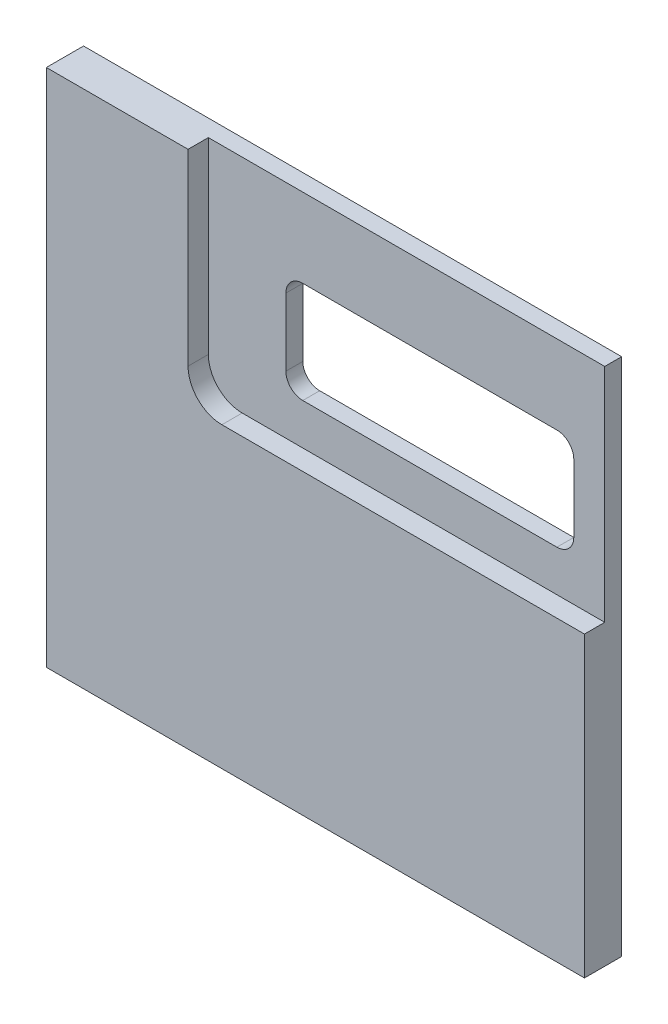
ISO-10303-21;
HEADER;
FILE_DESCRIPTION(('STEP AP214'),'2;1');
FILE_NAME('part.step','',(''),(''),'','','');
FILE_SCHEMA(('AUTOMOTIVE_DESIGN { 1 0 10303 214 1 1 1 1 }'));
ENDSEC;
DATA;
#1=APPLICATION_CONTEXT('core data for automotive mechanical design processes');
#2=APPLICATION_PROTOCOL_DEFINITION('international standard','automotive_design',2000,#1);
#3=PRODUCT_CONTEXT('',#1,'mechanical');
#4=PRODUCT('Part','Part','',(#3));
#5=PRODUCT_RELATED_PRODUCT_CATEGORY('part','',(#4));
#6=PRODUCT_DEFINITION_FORMATION('','',#4);
#7=PRODUCT_DEFINITION_CONTEXT('part definition',#1,'design');
#8=PRODUCT_DEFINITION('design','',#6,#7);
#9=PRODUCT_DEFINITION_SHAPE('','',#8);
#10=(LENGTH_UNIT() NAMED_UNIT(*) SI_UNIT(.MILLI.,.METRE.));
#11=(NAMED_UNIT(*) PLANE_ANGLE_UNIT() SI_UNIT($,.RADIAN.));
#12=(NAMED_UNIT(*) SI_UNIT($,.STERADIAN.) SOLID_ANGLE_UNIT());
#13=UNCERTAINTY_MEASURE_WITH_UNIT(LENGTH_MEASURE(1.E-05),#10,'distance_accuracy_value','');
#14=(GEOMETRIC_REPRESENTATION_CONTEXT(3) GLOBAL_UNCERTAINTY_ASSIGNED_CONTEXT((#13)) GLOBAL_UNIT_ASSIGNED_CONTEXT((#10,
#11,#12)) REPRESENTATION_CONTEXT('',''));
#15=CARTESIAN_POINT('',(0.,0.,0.));
#16=DIRECTION('',(0.,0.,1.));
#17=DIRECTION('',(1.,0.,0.));
#18=AXIS2_PLACEMENT_3D('',#15,#16,#17);
#19=CARTESIAN_POINT('',(14.495,-4.836,-2.53396));
#20=DIRECTION('',(0.,0.,1.));
#21=DIRECTION('',(0.,-1.,0.));
#22=AXIS2_PLACEMENT_3D('',#19,#20,#21);
#23=CYLINDRICAL_SURFACE('',#22,0.5);
#24=CARTESIAN_POINT('',(14.495,-4.836,-0.6));
#25=DIRECTION('',(0.,0.,-1.));
#26=DIRECTION('',(1.,0.,0.));
#27=AXIS2_PLACEMENT_3D('',#24,#25,#26);
#28=CIRCLE('',#27,0.5);
#29=CARTESIAN_POINT('',(14.995,-4.836,-0.6));
#30=VERTEX_POINT('',#29);
#31=CARTESIAN_POINT('',(14.495,-5.336,-0.6));
#32=VERTEX_POINT('',#31);
#33=EDGE_CURVE('E253',#30,#32,#28,.T.);
#34=ORIENTED_EDGE('',*,*,#33,.F.);
#35=DIRECTION('',(0.,0.,1.));
#36=VECTOR('',#35,1.);
#37=CARTESIAN_POINT('',(14.995,-4.836,-1.1));
#38=LINE('',#37,#36);
#39=CARTESIAN_POINT('',(14.995,-4.836,-1.1));
#40=VERTEX_POINT('',#39);
#41=EDGE_CURVE('E47',#40,#30,#38,.T.);
#42=ORIENTED_EDGE('',*,*,#41,.F.);
#43=CARTESIAN_POINT('',(14.495,-4.836,-1.1));
#44=DIRECTION('',(0.,0.,1.));
#45=DIRECTION('',(0.,-1.,0.));
#46=AXIS2_PLACEMENT_3D('',#43,#44,#45);
#47=CIRCLE('',#46,0.5);
#48=CARTESIAN_POINT('',(14.495,-5.336,-1.1));
#49=VERTEX_POINT('',#48);
#50=EDGE_CURVE('E321',#49,#40,#47,.T.);
#51=ORIENTED_EDGE('',*,*,#50,.F.);
#52=DIRECTION('',(0.,0.,1.));
#53=VECTOR('',#52,1.);
#54=CARTESIAN_POINT('',(14.495,-5.336,-1.1));
#55=LINE('',#54,#53);
#56=EDGE_CURVE('E11',#49,#32,#55,.T.);
#57=ORIENTED_EDGE('',*,*,#56,.T.);
#58=EDGE_LOOP('',(#34,#42,#51,#57));
#59=FACE_BOUND('',#58,.T.);
#60=ADVANCED_FACE('F17',(#59),#23,.F.);
#61=CARTESIAN_POINT('',(14.995,-5.336,-1.1));
#62=DIRECTION('',(0.,-1.,0.));
#63=DIRECTION('',(0.,0.,-1.));
#64=AXIS2_PLACEMENT_3D('',#61,#62,#63);
#65=PLANE('',#64);
#66=DIRECTION('',(-1.,0.,0.));
#67=VECTOR('',#66,1.);
#68=CARTESIAN_POINT('',(14.495,-5.336,-1.1));
#69=LINE('',#68,#67);
#70=CARTESIAN_POINT('',(6.982,-5.336,-1.1));
#71=VERTEX_POINT('',#70);
#72=EDGE_CURVE('E314',#49,#71,#69,.T.);
#73=ORIENTED_EDGE('',*,*,#72,.T.);
#74=DIRECTION('',(0.,0.,1.));
#75=VECTOR('',#74,1.);
#76=CARTESIAN_POINT('',(6.982,-5.336,-1.1));
#77=LINE('',#76,#75);
#78=CARTESIAN_POINT('',(6.982,-5.336,-0.6));
#79=VERTEX_POINT('',#78);
#80=EDGE_CURVE('E25',#71,#79,#77,.T.);
#81=ORIENTED_EDGE('',*,*,#80,.T.);
#82=DIRECTION('',(-1.,0.,0.));
#83=VECTOR('',#82,1.);
#84=CARTESIAN_POINT('',(14.495,-5.336,-0.6));
#85=LINE('',#84,#83);
#86=EDGE_CURVE('E267',#32,#79,#85,.T.);
#87=ORIENTED_EDGE('',*,*,#86,.F.);
#88=ORIENTED_EDGE('',*,*,#56,.F.);
#89=EDGE_LOOP('',(#73,#81,#87,#88));
#90=FACE_BOUND('',#89,.T.);
#91=ADVANCED_FACE('F361',(#90),#65,.F.);
#92=CARTESIAN_POINT('',(6.982,-4.836,-2.53396));
#93=DIRECTION('',(0.,0.,1.));
#94=DIRECTION('',(-1.,0.,0.));
#95=AXIS2_PLACEMENT_3D('',#92,#93,#94);
#96=CYLINDRICAL_SURFACE('',#95,0.5);
#97=CARTESIAN_POINT('',(6.982,-4.836,-0.6));
#98=DIRECTION('',(0.,0.,-1.));
#99=DIRECTION('',(0.,-1.,0.));
#100=AXIS2_PLACEMENT_3D('',#97,#98,#99);
#101=CIRCLE('',#100,0.5);
#102=CARTESIAN_POINT('',(6.482,-4.836,-0.6));
#103=VERTEX_POINT('',#102);
#104=EDGE_CURVE('E257',#79,#103,#101,.T.);
#105=ORIENTED_EDGE('',*,*,#104,.F.);
#106=ORIENTED_EDGE('',*,*,#80,.F.);
#107=CARTESIAN_POINT('',(6.982,-4.836,-1.1));
#108=DIRECTION('',(0.,0.,1.));
#109=DIRECTION('',(-1.,0.,0.));
#110=AXIS2_PLACEMENT_3D('',#107,#108,#109);
#111=CIRCLE('',#110,0.5);
#112=CARTESIAN_POINT('',(6.482,-4.836,-1.1));
#113=VERTEX_POINT('',#112);
#114=EDGE_CURVE('E310',#113,#71,#111,.T.);
#115=ORIENTED_EDGE('',*,*,#114,.F.);
#116=DIRECTION('',(0.,0.,1.));
#117=VECTOR('',#116,1.);
#118=CARTESIAN_POINT('',(6.482,-4.836,-1.1));
#119=LINE('',#118,#117);
#120=EDGE_CURVE('E336',#113,#103,#119,.T.);
#121=ORIENTED_EDGE('',*,*,#120,.T.);
#122=EDGE_LOOP('',(#105,#106,#115,#121));
#123=FACE_BOUND('',#122,.T.);
#124=ADVANCED_FACE('F351',(#123),#96,.F.);
#125=CARTESIAN_POINT('',(6.482,-5.336,-1.1));
#126=DIRECTION('',(-1.,0.,0.));
#127=DIRECTION('',(0.,0.,1.));
#128=AXIS2_PLACEMENT_3D('',#125,#126,#127);
#129=PLANE('',#128);
#130=DIRECTION('',(0.,1.,0.));
#131=VECTOR('',#130,1.);
#132=CARTESIAN_POINT('',(6.482,-4.836,-1.1));
#133=LINE('',#132,#131);
#134=CARTESIAN_POINT('',(6.482,-2.836,-1.1));
#135=VERTEX_POINT('',#134);
#136=EDGE_CURVE('E306',#113,#135,#133,.T.);
#137=ORIENTED_EDGE('',*,*,#136,.T.);
#138=DIRECTION('',(0.,0.,1.));
#139=VECTOR('',#138,1.);
#140=CARTESIAN_POINT('',(6.482,-2.836,-1.1));
#141=LINE('',#140,#139);
#142=CARTESIAN_POINT('',(6.482,-2.836,-0.6));
#143=VERTEX_POINT('',#142);
#144=EDGE_CURVE('E294',#135,#143,#141,.T.);
#145=ORIENTED_EDGE('',*,*,#144,.T.);
#146=DIRECTION('',(0.,1.,0.));
#147=VECTOR('',#146,1.);
#148=CARTESIAN_POINT('',(6.482,-4.836,-0.6));
#149=LINE('',#148,#147);
#150=EDGE_CURVE('E245',#103,#143,#149,.T.);
#151=ORIENTED_EDGE('',*,*,#150,.F.);
#152=ORIENTED_EDGE('',*,*,#120,.F.);
#153=EDGE_LOOP('',(#137,#145,#151,#152));
#154=FACE_BOUND('',#153,.T.);
#155=ADVANCED_FACE('F354',(#154),#129,.F.);
#156=CARTESIAN_POINT('',(6.982,-2.836,-2.53396));
#157=DIRECTION('',(0.,0.,1.));
#158=DIRECTION('',(0.,1.,0.));
#159=AXIS2_PLACEMENT_3D('',#156,#157,#158);
#160=CYLINDRICAL_SURFACE('',#159,0.5);
#161=CARTESIAN_POINT('',(6.982,-2.836,-0.6));
#162=DIRECTION('',(0.,0.,-1.));
#163=DIRECTION('',(-1.,0.,0.));
#164=AXIS2_PLACEMENT_3D('',#161,#162,#163);
#165=CIRCLE('',#164,0.5);
#166=CARTESIAN_POINT('',(6.982,-2.336,-0.6));
#167=VERTEX_POINT('',#166);
#168=EDGE_CURVE('E241',#143,#167,#165,.T.);
#169=ORIENTED_EDGE('',*,*,#168,.F.);
#170=ORIENTED_EDGE('',*,*,#144,.F.);
#171=CARTESIAN_POINT('',(6.982,-2.836,-1.1));
#172=DIRECTION('',(0.,0.,1.));
#173=DIRECTION('',(0.,1.,0.));
#174=AXIS2_PLACEMENT_3D('',#171,#172,#173);
#175=CIRCLE('',#174,0.5);
#176=CARTESIAN_POINT('',(6.982,-2.336,-1.1));
#177=VERTEX_POINT('',#176);
#178=EDGE_CURVE('E210',#177,#135,#175,.T.);
#179=ORIENTED_EDGE('',*,*,#178,.F.);
#180=DIRECTION('',(0.,0.,1.));
#181=VECTOR('',#180,1.);
#182=CARTESIAN_POINT('',(6.982,-2.336,-1.1));
#183=LINE('',#182,#181);
#184=EDGE_CURVE('E291',#177,#167,#183,.T.);
#185=ORIENTED_EDGE('',*,*,#184,.T.);
#186=EDGE_LOOP('',(#169,#170,#179,#185));
#187=FACE_BOUND('',#186,.T.);
#188=ADVANCED_FACE('F367',(#187),#160,.F.);
#189=CARTESIAN_POINT('',(6.482,-2.336,-1.1));
#190=DIRECTION('',(0.,1.,0.));
#191=DIRECTION('',(1.,0.,0.));
#192=AXIS2_PLACEMENT_3D('',#189,#190,#191);
#193=PLANE('',#192);
#194=DIRECTION('',(1.,0.,0.));
#195=VECTOR('',#194,1.);
#196=CARTESIAN_POINT('',(6.982,-2.336,-0.6));
#197=LINE('',#196,#195);
#198=CARTESIAN_POINT('',(14.495,-2.336,-0.6));
#199=VERTEX_POINT('',#198);
#200=EDGE_CURVE('E207',#167,#199,#197,.T.);
#201=ORIENTED_EDGE('',*,*,#200,.F.);
#202=ORIENTED_EDGE('',*,*,#184,.F.);
#203=DIRECTION('',(1.,0.,0.));
#204=VECTOR('',#203,1.);
#205=CARTESIAN_POINT('',(6.982,-2.336,-1.1));
#206=LINE('',#205,#204);
#207=CARTESIAN_POINT('',(14.495,-2.336,-1.1));
#208=VERTEX_POINT('',#207);
#209=EDGE_CURVE('E208',#177,#208,#206,.T.);
#210=ORIENTED_EDGE('',*,*,#209,.T.);
#211=DIRECTION('',(0.,0.,1.));
#212=VECTOR('',#211,1.);
#213=CARTESIAN_POINT('',(14.495,-2.336,-1.1));
#214=LINE('',#213,#212);
#215=EDGE_CURVE('E295',#208,#199,#214,.T.);
#216=ORIENTED_EDGE('',*,*,#215,.T.);
#217=EDGE_LOOP('',(#201,#202,#210,#216));
#218=FACE_BOUND('',#217,.T.);
#219=ADVANCED_FACE('F724',(#218),#193,.F.);
#220=CARTESIAN_POINT('',(14.495,-2.836,-2.53396));
#221=DIRECTION('',(0.,0.,1.));
#222=DIRECTION('',(1.,0.,0.));
#223=AXIS2_PLACEMENT_3D('',#220,#221,#222);
#224=CYLINDRICAL_SURFACE('',#223,0.5);
#225=CARTESIAN_POINT('',(14.495,-2.836,-0.6));
#226=DIRECTION('',(0.,0.,-1.));
#227=DIRECTION('',(0.,1.,0.));
#228=AXIS2_PLACEMENT_3D('',#225,#226,#227);
#229=CIRCLE('',#228,0.5);
#230=CARTESIAN_POINT('',(14.995,-2.836,-0.6));
#231=VERTEX_POINT('',#230);
#232=EDGE_CURVE('E232',#199,#231,#229,.T.);
#233=ORIENTED_EDGE('',*,*,#232,.F.);
#234=ORIENTED_EDGE('',*,*,#215,.F.);
#235=CARTESIAN_POINT('',(14.495,-2.836,-1.1));
#236=DIRECTION('',(0.,0.,1.));
#237=DIRECTION('',(1.,0.,0.));
#238=AXIS2_PLACEMENT_3D('',#235,#236,#237);
#239=CIRCLE('',#238,0.5);
#240=CARTESIAN_POINT('',(14.995,-2.836,-1.1));
#241=VERTEX_POINT('',#240);
#242=EDGE_CURVE('E180',#241,#208,#239,.T.);
#243=ORIENTED_EDGE('',*,*,#242,.F.);
#244=DIRECTION('',(0.,0.,1.));
#245=VECTOR('',#244,1.);
#246=CARTESIAN_POINT('',(14.995,-2.836,-1.1));
#247=LINE('',#246,#245);
#248=EDGE_CURVE('E317',#241,#231,#247,.T.);
#249=ORIENTED_EDGE('',*,*,#248,.T.);
#250=EDGE_LOOP('',(#233,#234,#243,#249));
#251=FACE_BOUND('',#250,.T.);
#252=ADVANCED_FACE('F728',(#251),#224,.F.);
#253=CARTESIAN_POINT('',(14.995,-2.336,-1.1));
#254=DIRECTION('',(1.,0.,0.));
#255=DIRECTION('',(0.,1.,0.));
#256=AXIS2_PLACEMENT_3D('',#253,#254,#255);
#257=PLANE('',#256);
#258=DIRECTION('',(0.,-1.,0.));
#259=VECTOR('',#258,1.);
#260=CARTESIAN_POINT('',(14.995,-2.836,-1.1));
#261=LINE('',#260,#259);
#262=EDGE_CURVE('E325',#241,#40,#261,.T.);
#263=ORIENTED_EDGE('',*,*,#262,.T.);
#264=ORIENTED_EDGE('',*,*,#41,.T.);
#265=DIRECTION('',(0.,-1.,0.));
#266=VECTOR('',#265,1.);
#267=CARTESIAN_POINT('',(14.995,-2.836,-0.6));
#268=LINE('',#267,#266);
#269=EDGE_CURVE('E236',#231,#30,#268,.T.);
#270=ORIENTED_EDGE('',*,*,#269,.F.);
#271=ORIENTED_EDGE('',*,*,#248,.F.);
#272=EDGE_LOOP('',(#263,#264,#270,#271));
#273=FACE_BOUND('',#272,.T.);
#274=ADVANCED_FACE('F737',(#273),#257,.F.);
#275=CARTESIAN_POINT('',(0.,-15.36,0.));
#276=DIRECTION('',(0.,1.,0.));
#277=DIRECTION('',(1.,0.,0.));
#278=AXIS2_PLACEMENT_3D('',#275,#276,#277);
#279=PLANE('',#278);
#280=DIRECTION('',(0.,0.,1.));
#281=VECTOR('',#280,1.);
#282=CARTESIAN_POINT('',(0.,-15.36,-1.1));
#283=LINE('',#282,#281);
#284=CARTESIAN_POINT('',(0.,-15.36,-1.1));
#285=VERTEX_POINT('',#284);
#286=CARTESIAN_POINT('',(0.,-15.36,0.));
#287=VERTEX_POINT('',#286);
#288=EDGE_CURVE('E328',#285,#287,#283,.T.);
#289=ORIENTED_EDGE('',*,*,#288,.F.);
#290=DIRECTION('',(-1.,0.,0.));
#291=VECTOR('',#290,1.);
#292=CARTESIAN_POINT('',(15.91,-15.36,-1.1));
#293=LINE('',#292,#291);
#294=CARTESIAN_POINT('',(15.91,-15.36,-1.1));
#295=VERTEX_POINT('',#294);
#296=EDGE_CURVE('E176',#295,#285,#293,.T.);
#297=ORIENTED_EDGE('',*,*,#296,.F.);
#298=DIRECTION('',(0.,0.,-1.));
#299=VECTOR('',#298,1.);
#300=CARTESIAN_POINT('',(15.91,-15.36,0.));
#301=LINE('',#300,#299);
#302=CARTESIAN_POINT('',(15.91,-15.36,0.));
#303=VERTEX_POINT('',#302);
#304=EDGE_CURVE('E286',#303,#295,#301,.T.);
#305=ORIENTED_EDGE('',*,*,#304,.F.);
#306=DIRECTION('',(1.,0.,0.));
#307=VECTOR('',#306,1.);
#308=CARTESIAN_POINT('',(0.,-15.36,0.));
#309=LINE('',#308,#307);
#310=EDGE_CURVE('E37',#287,#303,#309,.T.);
#311=ORIENTED_EDGE('',*,*,#310,.F.);
#312=EDGE_LOOP('',(#289,#297,#305,#311));
#313=FACE_BOUND('',#312,.T.);
#314=ADVANCED_FACE('F708',(#313),#279,.F.);
#315=CARTESIAN_POINT('',(4.19,0.,-0.6));
#316=DIRECTION('',(-1.,0.,0.));
#317=DIRECTION('',(0.,0.,1.));
#318=AXIS2_PLACEMENT_3D('',#315,#316,#317);
#319=PLANE('',#318);
#320=DIRECTION('',(0.,-1.,0.));
#321=VECTOR('',#320,1.);
#322=CARTESIAN_POINT('',(4.19,0.,-0.6));
#323=LINE('',#322,#321);
#324=CARTESIAN_POINT('',(4.19,0.,-0.6));
#325=VERTEX_POINT('',#324);
#326=CARTESIAN_POINT('',(4.19,-5.55282,-0.6));
#327=VERTEX_POINT('',#326);
#328=EDGE_CURVE('E240',#325,#327,#323,.T.);
#329=ORIENTED_EDGE('',*,*,#328,.F.);
#330=DIRECTION('',(0.,0.,-1.));
#331=VECTOR('',#330,1.);
#332=CARTESIAN_POINT('',(4.19,0.,0.));
#333=LINE('',#332,#331);
#334=CARTESIAN_POINT('',(4.19,0.,0.));
#335=VERTEX_POINT('',#334);
#336=EDGE_CURVE('E219',#335,#325,#333,.T.);
#337=ORIENTED_EDGE('',*,*,#336,.F.);
#338=DIRECTION('',(0.,-1.,0.));
#339=VECTOR('',#338,1.);
#340=CARTESIAN_POINT('',(4.19,0.,0.));
#341=LINE('',#340,#339);
#342=CARTESIAN_POINT('',(4.19,-5.55282,0.));
#343=VERTEX_POINT('',#342);
#344=EDGE_CURVE('E333',#335,#343,#341,.T.);
#345=ORIENTED_EDGE('',*,*,#344,.T.);
#346=DIRECTION('',(0.,0.,-1.));
#347=VECTOR('',#346,1.);
#348=CARTESIAN_POINT('',(4.19,-5.55282,0.));
#349=LINE('',#348,#347);
#350=EDGE_CURVE('E274',#343,#327,#349,.T.);
#351=ORIENTED_EDGE('',*,*,#350,.T.);
#352=EDGE_LOOP('',(#329,#337,#345,#351));
#353=FACE_BOUND('',#352,.T.);
#354=ADVANCED_FACE('F703',(#353),#319,.F.);
#355=CARTESIAN_POINT('',(0.,0.,0.));
#356=DIRECTION('',(0.,0.,1.));
#357=DIRECTION('',(1.,0.,0.));
#358=AXIS2_PLACEMENT_3D('',#355,#356,#357);
#359=PLANE('',#358);
#360=DIRECTION('',(1.,0.,0.));
#361=VECTOR('',#360,1.);
#362=CARTESIAN_POINT('',(0.,0.,0.));
#363=LINE('',#362,#361);
#364=CARTESIAN_POINT('',(0.,0.,0.));
#365=VERTEX_POINT('',#364);
#366=EDGE_CURVE('E190',#365,#335,#363,.T.);
#367=ORIENTED_EDGE('',*,*,#366,.F.);
#368=DIRECTION('',(0.,-1.,0.));
#369=VECTOR('',#368,1.);
#370=CARTESIAN_POINT('',(0.,0.,0.));
#371=LINE('',#370,#369);
#372=EDGE_CURVE('E185',#365,#287,#371,.T.);
#373=ORIENTED_EDGE('',*,*,#372,.T.);
#374=ORIENTED_EDGE('',*,*,#310,.T.);
#375=DIRECTION('',(0.,-1.,0.));
#376=VECTOR('',#375,1.);
#377=CARTESIAN_POINT('',(15.91,-6.55282,0.));
#378=LINE('',#377,#376);
#379=CARTESIAN_POINT('',(15.91,-6.55282,0.));
#380=VERTEX_POINT('',#379);
#381=EDGE_CURVE('E282',#380,#303,#378,.T.);
#382=ORIENTED_EDGE('',*,*,#381,.F.);
#383=DIRECTION('',(-1.,0.,0.));
#384=VECTOR('',#383,1.);
#385=CARTESIAN_POINT('',(15.91,-6.55282,0.));
#386=LINE('',#385,#384);
#387=CARTESIAN_POINT('',(5.19,-6.55282,0.));
#388=VERTEX_POINT('',#387);
#389=EDGE_CURVE('E215',#380,#388,#386,.T.);
#390=ORIENTED_EDGE('',*,*,#389,.T.);
#391=CARTESIAN_POINT('',(5.19,-5.55282,0.));
#392=DIRECTION('',(0.,0.,-1.));
#393=DIRECTION('',(0.,-1.,0.));
#394=AXIS2_PLACEMENT_3D('',#391,#392,#393);
#395=CIRCLE('',#394,1.);
#396=EDGE_CURVE('E216',#388,#343,#395,.T.);
#397=ORIENTED_EDGE('',*,*,#396,.T.);
#398=ORIENTED_EDGE('',*,*,#344,.F.);
#399=EDGE_LOOP('',(#367,#373,#374,#382,#390,#397,#398));
#400=FACE_BOUND('',#399,.T.);
#401=ADVANCED_FACE('F707',(#400),#359,.T.);
#402=CARTESIAN_POINT('',(0.,0.,-1.1));
#403=DIRECTION('',(-1.,0.,0.));
#404=DIRECTION('',(0.,0.,1.));
#405=AXIS2_PLACEMENT_3D('',#402,#403,#404);
#406=PLANE('',#405);
#407=DIRECTION('',(0.,-1.,0.));
#408=VECTOR('',#407,1.);
#409=CARTESIAN_POINT('',(0.,0.,-1.1));
#410=LINE('',#409,#408);
#411=CARTESIAN_POINT('',(0.,0.,-1.1));
#412=VERTEX_POINT('',#411);
#413=EDGE_CURVE('E169',#412,#285,#410,.T.);
#414=ORIENTED_EDGE('',*,*,#413,.T.);
#415=ORIENTED_EDGE('',*,*,#288,.T.);
#416=ORIENTED_EDGE('',*,*,#372,.F.);
#417=DIRECTION('',(0.,0.,1.));
#418=VECTOR('',#417,1.);
#419=CARTESIAN_POINT('',(0.,0.,-1.1));
#420=LINE('',#419,#418);
#421=EDGE_CURVE('E183',#412,#365,#420,.T.);
#422=ORIENTED_EDGE('',*,*,#421,.F.);
#423=EDGE_LOOP('',(#414,#415,#416,#422));
#424=FACE_BOUND('',#423,.T.);
#425=ADVANCED_FACE('F184',(#424),#406,.T.);
#426=CARTESIAN_POINT('',(15.91,0.,-1.1));
#427=DIRECTION('',(0.,0.,-1.));
#428=DIRECTION('',(0.,-1.,0.));
#429=AXIS2_PLACEMENT_3D('',#426,#427,#428);
#430=PLANE('',#429);
#431=ORIENTED_EDGE('',*,*,#242,.T.);
#432=ORIENTED_EDGE('',*,*,#209,.F.);
#433=ORIENTED_EDGE('',*,*,#178,.T.);
#434=ORIENTED_EDGE('',*,*,#136,.F.);
#435=ORIENTED_EDGE('',*,*,#114,.T.);
#436=ORIENTED_EDGE('',*,*,#72,.F.);
#437=ORIENTED_EDGE('',*,*,#50,.T.);
#438=ORIENTED_EDGE('',*,*,#262,.F.);
#439=EDGE_LOOP('',(#431,#432,#433,#434,#435,#436,#437,#438));
#440=FACE_BOUND('',#439,.T.);
#441=DIRECTION('',(0.,-1.,0.));
#442=VECTOR('',#441,1.);
#443=CARTESIAN_POINT('',(15.91,0.,-1.1));
#444=LINE('',#443,#442);
#445=CARTESIAN_POINT('',(15.91,0.,-1.1));
#446=VERTEX_POINT('',#445);
#447=EDGE_CURVE('E290',#446,#295,#444,.T.);
#448=ORIENTED_EDGE('',*,*,#447,.T.);
#449=ORIENTED_EDGE('',*,*,#296,.T.);
#450=ORIENTED_EDGE('',*,*,#413,.F.);
#451=DIRECTION('',(-1.,0.,0.));
#452=VECTOR('',#451,1.);
#453=CARTESIAN_POINT('',(15.91,0.,-1.1));
#454=LINE('',#453,#452);
#455=EDGE_CURVE('E174',#446,#412,#454,.T.);
#456=ORIENTED_EDGE('',*,*,#455,.F.);
#457=EDGE_LOOP('',(#448,#449,#450,#456));
#458=FACE_BOUND('',#457,.T.);
#459=ADVANCED_FACE('F172',(#440,#458),#430,.T.);
#460=CARTESIAN_POINT('',(15.91,0.,0.));
#461=DIRECTION('',(1.,0.,0.));
#462=DIRECTION('',(0.,1.,0.));
#463=AXIS2_PLACEMENT_3D('',#460,#461,#462);
#464=PLANE('',#463);
#465=DIRECTION('',(0.,-1.,0.));
#466=VECTOR('',#465,1.);
#467=CARTESIAN_POINT('',(15.91,0.,-0.6));
#468=LINE('',#467,#466);
#469=CARTESIAN_POINT('',(15.91,0.,-0.6));
#470=VERTEX_POINT('',#469);
#471=CARTESIAN_POINT('',(15.91,-6.55282,-0.6));
#472=VERTEX_POINT('',#471);
#473=EDGE_CURVE('E231',#470,#472,#468,.T.);
#474=ORIENTED_EDGE('',*,*,#473,.T.);
#475=DIRECTION('',(0.,0.,-1.));
#476=VECTOR('',#475,1.);
#477=CARTESIAN_POINT('',(15.91,-6.55282,0.));
#478=LINE('',#477,#476);
#479=EDGE_CURVE('E270',#380,#472,#478,.T.);
#480=ORIENTED_EDGE('',*,*,#479,.F.);
#481=ORIENTED_EDGE('',*,*,#381,.T.);
#482=ORIENTED_EDGE('',*,*,#304,.T.);
#483=ORIENTED_EDGE('',*,*,#447,.F.);
#484=DIRECTION('',(0.,0.,-1.));
#485=VECTOR('',#484,1.);
#486=CARTESIAN_POINT('',(15.91,0.,-0.6));
#487=LINE('',#486,#485);
#488=EDGE_CURVE('E195',#470,#446,#487,.T.);
#489=ORIENTED_EDGE('',*,*,#488,.F.);
#490=EDGE_LOOP('',(#474,#480,#481,#482,#483,#489));
#491=FACE_BOUND('',#490,.T.);
#492=ADVANCED_FACE('F692',(#491),#464,.T.);
#493=CARTESIAN_POINT('',(0.,-6.55282,0.));
#494=DIRECTION('',(0.,1.,0.));
#495=DIRECTION('',(1.,0.,0.));
#496=AXIS2_PLACEMENT_3D('',#493,#494,#495);
#497=PLANE('',#496);
#498=ORIENTED_EDGE('',*,*,#389,.F.);
#499=ORIENTED_EDGE('',*,*,#479,.T.);
#500=DIRECTION('',(-1.,0.,0.));
#501=VECTOR('',#500,1.);
#502=CARTESIAN_POINT('',(15.91,-6.55282,-0.6));
#503=LINE('',#502,#501);
#504=CARTESIAN_POINT('',(5.19,-6.55282,-0.6));
#505=VERTEX_POINT('',#504);
#506=EDGE_CURVE('E224',#472,#505,#503,.T.);
#507=ORIENTED_EDGE('',*,*,#506,.T.);
#508=DIRECTION('',(0.,0.,-1.));
#509=VECTOR('',#508,1.);
#510=CARTESIAN_POINT('',(5.19,-6.55282,0.));
#511=LINE('',#510,#509);
#512=EDGE_CURVE('E212',#388,#505,#511,.T.);
#513=ORIENTED_EDGE('',*,*,#512,.F.);
#514=EDGE_LOOP('',(#498,#499,#507,#513));
#515=FACE_BOUND('',#514,.T.);
#516=ADVANCED_FACE('F696',(#515),#497,.T.);
#517=CARTESIAN_POINT('',(5.19,-5.55282,1.43396));
#518=DIRECTION('',(0.,0.,-1.));
#519=DIRECTION('',(0.,-1.,0.));
#520=AXIS2_PLACEMENT_3D('',#517,#518,#519);
#521=CYLINDRICAL_SURFACE('',#520,1.);
#522=ORIENTED_EDGE('',*,*,#350,.F.);
#523=ORIENTED_EDGE('',*,*,#396,.F.);
#524=ORIENTED_EDGE('',*,*,#512,.T.);
#525=CARTESIAN_POINT('',(5.19,-5.55282,-0.6));
#526=DIRECTION('',(0.,0.,1.));
#527=DIRECTION('',(-1.,0.,0.));
#528=AXIS2_PLACEMENT_3D('',#525,#526,#527);
#529=CIRCLE('',#528,1.);
#530=EDGE_CURVE('E249',#327,#505,#529,.T.);
#531=ORIENTED_EDGE('',*,*,#530,.F.);
#532=EDGE_LOOP('',(#522,#523,#524,#531));
#533=FACE_BOUND('',#532,.T.);
#534=ADVANCED_FACE('F686',(#533),#521,.F.);
#535=CARTESIAN_POINT('',(15.91,0.,-0.6));
#536=DIRECTION('',(0.,0.,-1.));
#537=DIRECTION('',(0.,-1.,0.));
#538=AXIS2_PLACEMENT_3D('',#535,#536,#537);
#539=PLANE('',#538);
#540=ORIENTED_EDGE('',*,*,#104,.T.);
#541=ORIENTED_EDGE('',*,*,#150,.T.);
#542=ORIENTED_EDGE('',*,*,#168,.T.);
#543=ORIENTED_EDGE('',*,*,#200,.T.);
#544=ORIENTED_EDGE('',*,*,#232,.T.);
#545=ORIENTED_EDGE('',*,*,#269,.T.);
#546=ORIENTED_EDGE('',*,*,#33,.T.);
#547=ORIENTED_EDGE('',*,*,#86,.T.);
#548=EDGE_LOOP('',(#540,#541,#542,#543,#544,#545,#546,#547));
#549=FACE_BOUND('',#548,.T.);
#550=ORIENTED_EDGE('',*,*,#506,.F.);
#551=ORIENTED_EDGE('',*,*,#473,.F.);
#552=DIRECTION('',(-1.,0.,0.));
#553=VECTOR('',#552,1.);
#554=CARTESIAN_POINT('',(15.91,0.,-0.6));
#555=LINE('',#554,#553);
#556=EDGE_CURVE('E220',#470,#325,#555,.T.);
#557=ORIENTED_EDGE('',*,*,#556,.T.);
#558=ORIENTED_EDGE('',*,*,#328,.T.);
#559=ORIENTED_EDGE('',*,*,#530,.T.);
#560=EDGE_LOOP('',(#550,#551,#557,#558,#559));
#561=FACE_BOUND('',#560,.T.);
#562=ADVANCED_FACE('F357',(#549,#561),#539,.F.);
#563=CARTESIAN_POINT('',(0.,0.,0.));
#564=DIRECTION('',(0.,1.,0.));
#565=DIRECTION('',(1.,0.,0.));
#566=AXIS2_PLACEMENT_3D('',#563,#564,#565);
#567=PLANE('',#566);
#568=ORIENTED_EDGE('',*,*,#488,.T.);
#569=ORIENTED_EDGE('',*,*,#455,.T.);
#570=ORIENTED_EDGE('',*,*,#421,.T.);
#571=ORIENTED_EDGE('',*,*,#366,.T.);
#572=ORIENTED_EDGE('',*,*,#336,.T.);
#573=ORIENTED_EDGE('',*,*,#556,.F.);
#574=EDGE_LOOP('',(#568,#569,#570,#571,#572,#573));
#575=FACE_BOUND('',#574,.T.);
#576=ADVANCED_FACE('F192',(#575),#567,.T.);
#577=CLOSED_SHELL('',(#60,#91,#124,#155,#188,#219,#252,#274,#314,#354,#401,#425,#459,#492,#516,
#534,#562,#576));
#578=MANIFOLD_SOLID_BREP('B1',#577);
#579=ADVANCED_BREP_SHAPE_REPRESENTATION('',(#18,#578),#14);
#580=SHAPE_DEFINITION_REPRESENTATION(#9,#579);
ENDSEC;
END-ISO-10303-21;
